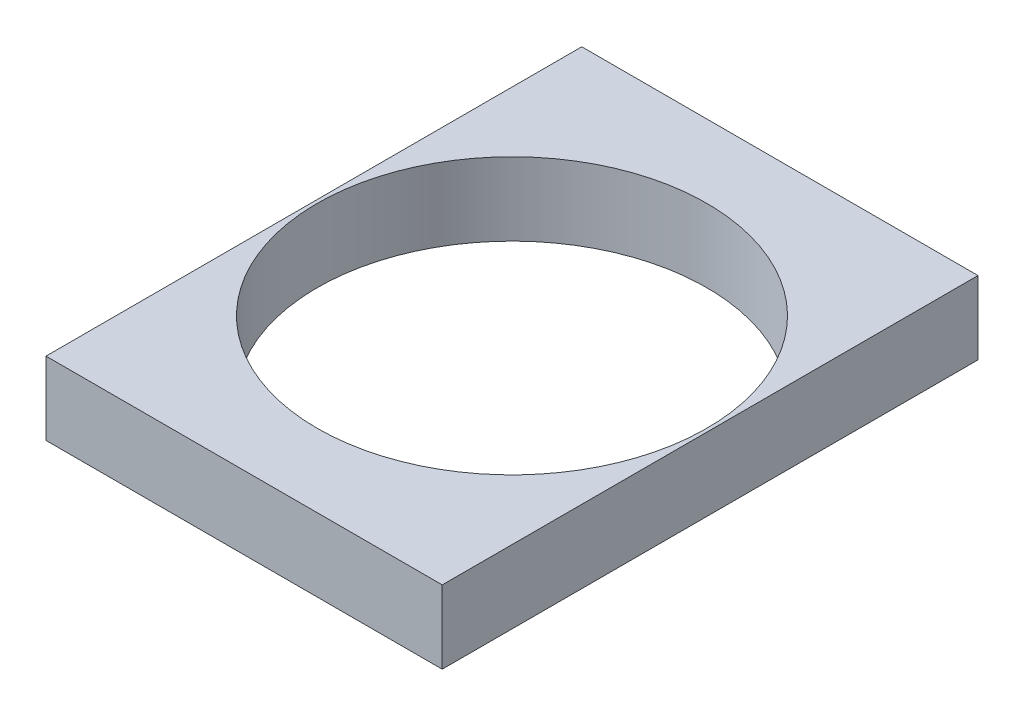
ISO-10303-21;
HEADER;
FILE_DESCRIPTION(('STEP AP214'),'2;1');
FILE_NAME('part.step','',(''),(''),'','','');
FILE_SCHEMA(('AUTOMOTIVE_DESIGN { 1 0 10303 214 1 1 1 1 }'));
ENDSEC;
DATA;
#1=APPLICATION_CONTEXT('core data for automotive mechanical design processes');
#2=APPLICATION_PROTOCOL_DEFINITION('international standard','automotive_design',2000,#1);
#3=PRODUCT_CONTEXT('',#1,'mechanical');
#4=PRODUCT('Part','Part','',(#3));
#5=PRODUCT_RELATED_PRODUCT_CATEGORY('part','',(#4));
#6=PRODUCT_DEFINITION_FORMATION('','',#4);
#7=PRODUCT_DEFINITION_CONTEXT('part definition',#1,'design');
#8=PRODUCT_DEFINITION('design','',#6,#7);
#9=PRODUCT_DEFINITION_SHAPE('','',#8);
#10=(LENGTH_UNIT() NAMED_UNIT(*) SI_UNIT(.MILLI.,.METRE.));
#11=(NAMED_UNIT(*) PLANE_ANGLE_UNIT() SI_UNIT($,.RADIAN.));
#12=(NAMED_UNIT(*) SI_UNIT($,.STERADIAN.) SOLID_ANGLE_UNIT());
#13=UNCERTAINTY_MEASURE_WITH_UNIT(LENGTH_MEASURE(1.E-05),#10,'distance_accuracy_value','');
#14=(GEOMETRIC_REPRESENTATION_CONTEXT(3) GLOBAL_UNCERTAINTY_ASSIGNED_CONTEXT((#13)) GLOBAL_UNIT_ASSIGNED_CONTEXT((#10,
#11,#12)) REPRESENTATION_CONTEXT('',''));
#15=CARTESIAN_POINT('',(0.,0.,0.));
#16=DIRECTION('',(0.,0.,1.));
#17=DIRECTION('',(1.,0.,0.));
#18=AXIS2_PLACEMENT_3D('',#15,#16,#17);
#19=CARTESIAN_POINT('',(0.,3.,0.));
#20=DIRECTION('',(0.,-1.,0.));
#21=DIRECTION('',(0.,0.,-1.));
#22=AXIS2_PLACEMENT_3D('',#19,#20,#21);
#23=PLANE('',#22);
#24=DIRECTION('',(0.,0.,-1.));
#25=VECTOR('',#24,1.);
#26=CARTESIAN_POINT('',(8.135,3.,11.));
#27=LINE('',#26,#25);
#28=CARTESIAN_POINT('',(8.135,3.,11.));
#29=VERTEX_POINT('',#28);
#30=CARTESIAN_POINT('',(8.135,3.,-11.));
#31=VERTEX_POINT('',#30);
#32=EDGE_CURVE('E98',#29,#31,#27,.T.);
#33=ORIENTED_EDGE('',*,*,#32,.T.);
#34=DIRECTION('',(-1.,0.,0.));
#35=VECTOR('',#34,1.);
#36=CARTESIAN_POINT('',(-8.135,3.,-11.));
#37=LINE('',#36,#35);
#38=CARTESIAN_POINT('',(-8.135,3.,-11.));
#39=VERTEX_POINT('',#38);
#40=EDGE_CURVE('E93',#31,#39,#37,.T.);
#41=ORIENTED_EDGE('',*,*,#40,.T.);
#42=DIRECTION('',(0.,0.,1.));
#43=VECTOR('',#42,1.);
#44=CARTESIAN_POINT('',(-8.135,3.,11.));
#45=LINE('',#44,#43);
#46=CARTESIAN_POINT('',(-8.135,3.,11.));
#47=VERTEX_POINT('',#46);
#48=EDGE_CURVE('E96',#39,#47,#45,.T.);
#49=ORIENTED_EDGE('',*,*,#48,.T.);
#50=DIRECTION('',(1.,0.,0.));
#51=VECTOR('',#50,1.);
#52=CARTESIAN_POINT('',(-8.135,3.,11.));
#53=LINE('',#52,#51);
#54=EDGE_CURVE('E63',#47,#29,#53,.T.);
#55=ORIENTED_EDGE('',*,*,#54,.T.);
#56=EDGE_LOOP('',(#33,#41,#49,#55));
#57=FACE_BOUND('',#56,.T.);
#58=CARTESIAN_POINT('',(0.,3.,0.));
#59=DIRECTION('',(0.,1.,0.));
#60=DIRECTION('',(0.,0.,1.));
#61=AXIS2_PLACEMENT_3D('',#58,#59,#60);
#62=CIRCLE('',#61,8.);
#63=CARTESIAN_POINT('',(0.,3.,8.));
#64=VERTEX_POINT('',#63);
#65=EDGE_CURVE('E118',#64,#64,#62,.T.);
#66=ORIENTED_EDGE('',*,*,#65,.F.);
#67=EDGE_LOOP('',(#66));
#68=FACE_BOUND('',#67,.T.);
#69=ADVANCED_FACE('F45',(#57,#68),#23,.F.);
#70=CARTESIAN_POINT('',(0.,0.,0.));
#71=DIRECTION('',(0.,-1.,0.));
#72=DIRECTION('',(0.,0.,-1.));
#73=AXIS2_PLACEMENT_3D('',#70,#71,#72);
#74=PLANE('',#73);
#75=DIRECTION('',(0.,0.,-1.));
#76=VECTOR('',#75,1.);
#77=CARTESIAN_POINT('',(8.135,0.,11.));
#78=LINE('',#77,#76);
#79=CARTESIAN_POINT('',(8.135,0.,11.));
#80=VERTEX_POINT('',#79);
#81=CARTESIAN_POINT('',(8.135,0.,-11.));
#82=VERTEX_POINT('',#81);
#83=EDGE_CURVE('E114',#80,#82,#78,.T.);
#84=ORIENTED_EDGE('',*,*,#83,.F.);
#85=DIRECTION('',(1.,0.,0.));
#86=VECTOR('',#85,1.);
#87=CARTESIAN_POINT('',(-8.135,0.,11.));
#88=LINE('',#87,#86);
#89=CARTESIAN_POINT('',(-8.135,0.,11.));
#90=VERTEX_POINT('',#89);
#91=EDGE_CURVE('E86',#90,#80,#88,.T.);
#92=ORIENTED_EDGE('',*,*,#91,.F.);
#93=DIRECTION('',(0.,0.,1.));
#94=VECTOR('',#93,1.);
#95=CARTESIAN_POINT('',(-8.135,0.,11.));
#96=LINE('',#95,#94);
#97=CARTESIAN_POINT('',(-8.135,0.,-11.));
#98=VERTEX_POINT('',#97);
#99=EDGE_CURVE('E80',#98,#90,#96,.T.);
#100=ORIENTED_EDGE('',*,*,#99,.F.);
#101=DIRECTION('',(-1.,0.,0.));
#102=VECTOR('',#101,1.);
#103=CARTESIAN_POINT('',(-8.135,0.,-11.));
#104=LINE('',#103,#102);
#105=EDGE_CURVE('E103',#82,#98,#104,.T.);
#106=ORIENTED_EDGE('',*,*,#105,.F.);
#107=EDGE_LOOP('',(#84,#92,#100,#106));
#108=FACE_BOUND('',#107,.T.);
#109=CARTESIAN_POINT('',(0.,0.,0.));
#110=DIRECTION('',(0.,1.,0.));
#111=DIRECTION('',(0.,0.,1.));
#112=AXIS2_PLACEMENT_3D('',#109,#110,#111);
#113=CIRCLE('',#112,8.);
#114=CARTESIAN_POINT('',(0.,0.,8.));
#115=VERTEX_POINT('',#114);
#116=EDGE_CURVE('E136',#115,#115,#113,.T.);
#117=ORIENTED_EDGE('',*,*,#116,.T.);
#118=EDGE_LOOP('',(#117));
#119=FACE_BOUND('',#118,.T.);
#120=ADVANCED_FACE('F131',(#108,#119),#74,.T.);
#121=CARTESIAN_POINT('',(8.135,3.,11.));
#122=DIRECTION('',(-1.,0.,0.));
#123=DIRECTION('',(0.,0.,1.));
#124=AXIS2_PLACEMENT_3D('',#121,#122,#123);
#125=PLANE('',#124);
#126=ORIENTED_EDGE('',*,*,#83,.T.);
#127=DIRECTION('',(0.,-1.,0.));
#128=VECTOR('',#127,1.);
#129=CARTESIAN_POINT('',(8.135,3.,-11.));
#130=LINE('',#129,#128);
#131=EDGE_CURVE('E11',#31,#82,#130,.T.);
#132=ORIENTED_EDGE('',*,*,#131,.F.);
#133=ORIENTED_EDGE('',*,*,#32,.F.);
#134=DIRECTION('',(0.,-1.,0.));
#135=VECTOR('',#134,1.);
#136=CARTESIAN_POINT('',(8.135,3.,11.));
#137=LINE('',#136,#135);
#138=EDGE_CURVE('E110',#29,#80,#137,.T.);
#139=ORIENTED_EDGE('',*,*,#138,.T.);
#140=EDGE_LOOP('',(#126,#132,#133,#139));
#141=FACE_BOUND('',#140,.T.);
#142=ADVANCED_FACE('F47',(#141),#125,.F.);
#143=CARTESIAN_POINT('',(-8.135,3.,-11.));
#144=DIRECTION('',(0.,0.,1.));
#145=DIRECTION('',(1.,0.,0.));
#146=AXIS2_PLACEMENT_3D('',#143,#144,#145);
#147=PLANE('',#146);
#148=ORIENTED_EDGE('',*,*,#105,.T.);
#149=DIRECTION('',(0.,-1.,0.));
#150=VECTOR('',#149,1.);
#151=CARTESIAN_POINT('',(-8.135,3.,-11.));
#152=LINE('',#151,#150);
#153=EDGE_CURVE('E55',#39,#98,#152,.T.);
#154=ORIENTED_EDGE('',*,*,#153,.F.);
#155=ORIENTED_EDGE('',*,*,#40,.F.);
#156=ORIENTED_EDGE('',*,*,#131,.T.);
#157=EDGE_LOOP('',(#148,#154,#155,#156));
#158=FACE_BOUND('',#157,.T.);
#159=ADVANCED_FACE('F102',(#158),#147,.F.);
#160=CARTESIAN_POINT('',(-8.135,3.,11.));
#161=DIRECTION('',(1.,0.,0.));
#162=DIRECTION('',(0.,0.,-1.));
#163=AXIS2_PLACEMENT_3D('',#160,#161,#162);
#164=PLANE('',#163);
#165=ORIENTED_EDGE('',*,*,#99,.T.);
#166=DIRECTION('',(0.,-1.,0.));
#167=VECTOR('',#166,1.);
#168=CARTESIAN_POINT('',(-8.135,3.,11.));
#169=LINE('',#168,#167);
#170=EDGE_CURVE('E105',#47,#90,#169,.T.);
#171=ORIENTED_EDGE('',*,*,#170,.F.);
#172=ORIENTED_EDGE('',*,*,#48,.F.);
#173=ORIENTED_EDGE('',*,*,#153,.T.);
#174=EDGE_LOOP('',(#165,#171,#172,#173));
#175=FACE_BOUND('',#174,.T.);
#176=ADVANCED_FACE('F106',(#175),#164,.F.);
#177=CARTESIAN_POINT('',(-8.135,3.,11.));
#178=DIRECTION('',(0.,0.,-1.));
#179=DIRECTION('',(-1.,0.,0.));
#180=AXIS2_PLACEMENT_3D('',#177,#178,#179);
#181=PLANE('',#180);
#182=ORIENTED_EDGE('',*,*,#91,.T.);
#183=ORIENTED_EDGE('',*,*,#138,.F.);
#184=ORIENTED_EDGE('',*,*,#54,.F.);
#185=ORIENTED_EDGE('',*,*,#170,.T.);
#186=EDGE_LOOP('',(#182,#183,#184,#185));
#187=FACE_BOUND('',#186,.T.);
#188=ADVANCED_FACE('F128',(#187),#181,.F.);
#189=CARTESIAN_POINT('',(0.,3.,0.));
#190=DIRECTION('',(0.,-1.,0.));
#191=DIRECTION('',(0.,0.,-1.));
#192=AXIS2_PLACEMENT_3D('',#189,#190,#191);
#193=CYLINDRICAL_SURFACE('',#192,8.);
#194=ORIENTED_EDGE('',*,*,#65,.T.);
#195=EDGE_LOOP('',(#194));
#196=FACE_BOUND('',#195,.T.);
#197=ORIENTED_EDGE('',*,*,#116,.F.);
#198=EDGE_LOOP('',(#197));
#199=FACE_BOUND('',#198,.T.);
#200=ADVANCED_FACE('F144',(#196,#199),#193,.F.);
#201=CLOSED_SHELL('',(#69,#120,#142,#159,#176,#188,#200));
#202=MANIFOLD_SOLID_BREP('B2',#201);
#203=ADVANCED_BREP_SHAPE_REPRESENTATION('',(#18,#202),#14);
#204=SHAPE_DEFINITION_REPRESENTATION(#9,#203);
ENDSEC;
END-ISO-10303-21;
